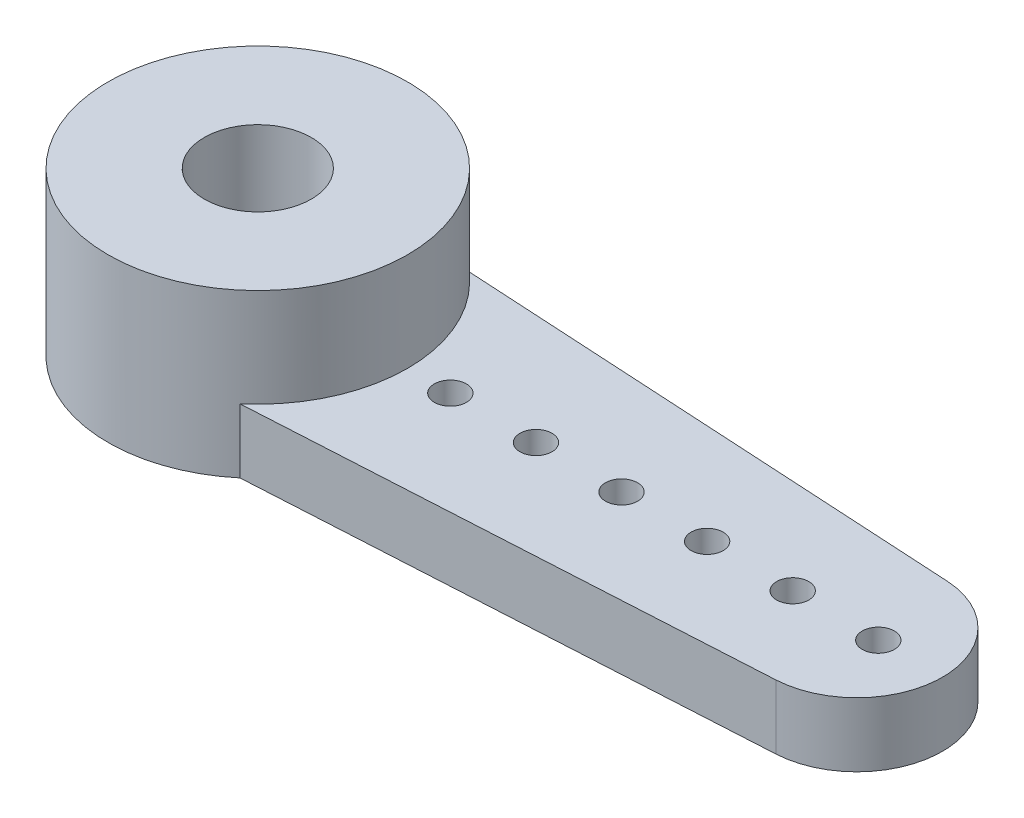
ISO-10303-21;
HEADER;
FILE_DESCRIPTION(('STEP AP214'),'2;1');
FILE_NAME('part.step','',(''),(''),'','','');
FILE_SCHEMA(('AUTOMOTIVE_DESIGN { 1 0 10303 214 1 1 1 1 }'));
ENDSEC;
DATA;
#1=APPLICATION_CONTEXT('core data for automotive mechanical design processes');
#2=APPLICATION_PROTOCOL_DEFINITION('international standard','automotive_design',2000,#1);
#3=PRODUCT_CONTEXT('',#1,'mechanical');
#4=PRODUCT('Part','Part','',(#3));
#5=PRODUCT_RELATED_PRODUCT_CATEGORY('part','',(#4));
#6=PRODUCT_DEFINITION_FORMATION('','',#4);
#7=PRODUCT_DEFINITION_CONTEXT('part definition',#1,'design');
#8=PRODUCT_DEFINITION('design','',#6,#7);
#9=PRODUCT_DEFINITION_SHAPE('','',#8);
#10=(LENGTH_UNIT() NAMED_UNIT(*) SI_UNIT(.MILLI.,.METRE.));
#11=(NAMED_UNIT(*) PLANE_ANGLE_UNIT() SI_UNIT($,.RADIAN.));
#12=(NAMED_UNIT(*) SI_UNIT($,.STERADIAN.) SOLID_ANGLE_UNIT());
#13=UNCERTAINTY_MEASURE_WITH_UNIT(LENGTH_MEASURE(1.E-05),#10,'distance_accuracy_value','');
#14=(GEOMETRIC_REPRESENTATION_CONTEXT(3) GLOBAL_UNCERTAINTY_ASSIGNED_CONTEXT((#13)) GLOBAL_UNIT_ASSIGNED_CONTEXT((#10,
#11,#12)) REPRESENTATION_CONTEXT('',''));
#15=CARTESIAN_POINT('',(0.,0.,0.));
#16=DIRECTION('',(0.,0.,1.));
#17=DIRECTION('',(1.,0.,0.));
#18=AXIS2_PLACEMENT_3D('',#15,#16,#17);
#19=CARTESIAN_POINT('',(0.,1.5,0.));
#20=DIRECTION('',(0.,-1.,0.));
#21=DIRECTION('',(0.,0.,-1.));
#22=AXIS2_PLACEMENT_3D('',#19,#20,#21);
#23=CYLINDRICAL_SURFACE('',#22,3.5);
#24=CARTESIAN_POINT('',(0.,0.,0.));
#25=DIRECTION('',(0.,1.,0.));
#26=DIRECTION('',(0.,0.,1.));
#27=AXIS2_PLACEMENT_3D('',#24,#25,#26);
#28=CIRCLE('',#27,3.5);
#29=CARTESIAN_POINT('',(2.25707221860533,0.,-2.675));
#30=VERTEX_POINT('',#29);
#31=CARTESIAN_POINT('',(2.25707221860533,0.,2.675));
#32=VERTEX_POINT('',#31);
#33=EDGE_CURVE('E88',#30,#32,#28,.T.);
#34=ORIENTED_EDGE('',*,*,#33,.T.);
#35=DIRECTION('',(0.,-1.,0.));
#36=VECTOR('',#35,1.);
#37=CARTESIAN_POINT('',(2.25707221860533,1.5,2.675));
#38=LINE('',#37,#36);
#39=CARTESIAN_POINT('',(2.25707221860533,1.5,2.675));
#40=VERTEX_POINT('',#39);
#41=EDGE_CURVE('E12',#40,#32,#38,.T.);
#42=ORIENTED_EDGE('',*,*,#41,.F.);
#43=CARTESIAN_POINT('',(0.,1.5,0.));
#44=DIRECTION('',(0.,1.,0.));
#45=DIRECTION('',(0.,0.,1.));
#46=AXIS2_PLACEMENT_3D('',#43,#44,#45);
#47=CIRCLE('',#46,3.5);
#48=CARTESIAN_POINT('',(2.25707221860533,1.5,-2.675));
#49=VERTEX_POINT('',#48);
#50=EDGE_CURVE('E86',#40,#49,#47,.T.);
#51=ORIENTED_EDGE('',*,*,#50,.T.);
#52=DIRECTION('',(0.,-1.,0.));
#53=VECTOR('',#52,1.);
#54=CARTESIAN_POINT('',(2.25707221860533,1.5,-2.675));
#55=LINE('',#54,#53);
#56=EDGE_CURVE('E107',#49,#30,#55,.T.);
#57=ORIENTED_EDGE('',*,*,#56,.T.);
#58=EDGE_LOOP('',(#34,#42,#51,#57));
#59=FACE_BOUND('',#58,.T.);
#60=CARTESIAN_POINT('',(0.,3.8,0.));
#61=DIRECTION('',(0.,1.,0.));
#62=DIRECTION('',(0.,0.,1.));
#63=AXIS2_PLACEMENT_3D('',#60,#61,#62);
#64=CIRCLE('',#63,3.5);
#65=CARTESIAN_POINT('',(0.,3.8,3.5));
#66=VERTEX_POINT('',#65);
#67=EDGE_CURVE('E95',#66,#66,#64,.T.);
#68=ORIENTED_EDGE('',*,*,#67,.F.);
#69=EDGE_LOOP('',(#68));
#70=FACE_BOUND('',#69,.T.);
#71=ADVANCED_FACE('F35',(#59,#70),#23,.T.);
#72=CARTESIAN_POINT('',(14.1106495792047,1.5,2.));
#73=DIRECTION('',(-0.0568527304419953,0.,-0.998382575489622));
#74=DIRECTION('',(-0.998382575489622,0.,0.0568527304419953));
#75=AXIS2_PLACEMENT_3D('',#72,#73,#74);
#76=PLANE('',#75);
#77=DIRECTION('',(0.998382575489622,0.,-0.0568527304419953));
#78=VECTOR('',#77,1.);
#79=CARTESIAN_POINT('',(14.1106495792047,0.,2.));
#80=LINE('',#79,#78);
#81=CARTESIAN_POINT('',(14.1106495792047,0.,2.));
#82=VERTEX_POINT('',#81);
#83=EDGE_CURVE('E109',#32,#82,#80,.T.);
#84=ORIENTED_EDGE('',*,*,#83,.T.);
#85=DIRECTION('',(0.,-1.,0.));
#86=VECTOR('',#85,1.);
#87=CARTESIAN_POINT('',(14.1106495792047,1.5,2.));
#88=LINE('',#87,#86);
#89=CARTESIAN_POINT('',(14.1106495792047,1.5,2.));
#90=VERTEX_POINT('',#89);
#91=EDGE_CURVE('E43',#90,#82,#88,.T.);
#92=ORIENTED_EDGE('',*,*,#91,.F.);
#93=DIRECTION('',(0.998382575489622,0.,-0.0568527304419953));
#94=VECTOR('',#93,1.);
#95=CARTESIAN_POINT('',(14.1106495792047,1.5,2.));
#96=LINE('',#95,#94);
#97=EDGE_CURVE('E78',#40,#90,#96,.T.);
#98=ORIENTED_EDGE('',*,*,#97,.F.);
#99=ORIENTED_EDGE('',*,*,#41,.T.);
#100=EDGE_LOOP('',(#84,#92,#98,#99));
#101=FACE_BOUND('',#100,.T.);
#102=ADVANCED_FACE('F90',(#101),#76,.F.);
#103=CARTESIAN_POINT('',(13.9967599103789,1.5,0.));
#104=DIRECTION('',(0.,-1.,0.));
#105=DIRECTION('',(0.,0.,-1.));
#106=AXIS2_PLACEMENT_3D('',#103,#104,#105);
#107=CYLINDRICAL_SURFACE('',#106,2.00324008962113);
#108=CARTESIAN_POINT('',(13.9967599103789,0.,0.));
#109=DIRECTION('',(0.,1.,0.));
#110=DIRECTION('',(0.,0.,-1.));
#111=AXIS2_PLACEMENT_3D('',#108,#109,#110);
#112=CIRCLE('',#111,2.00324008962113);
#113=CARTESIAN_POINT('',(14.1106495792047,0.,-2.));
#114=VERTEX_POINT('',#113);
#115=EDGE_CURVE('E69',#82,#114,#112,.T.);
#116=ORIENTED_EDGE('',*,*,#115,.T.);
#117=DIRECTION('',(0.,-1.,0.));
#118=VECTOR('',#117,1.);
#119=CARTESIAN_POINT('',(14.1106495792047,1.5,-2.));
#120=LINE('',#119,#118);
#121=CARTESIAN_POINT('',(14.1106495792047,1.5,-2.));
#122=VERTEX_POINT('',#121);
#123=EDGE_CURVE('E114',#122,#114,#120,.T.);
#124=ORIENTED_EDGE('',*,*,#123,.F.);
#125=CARTESIAN_POINT('',(13.9967599103789,1.5,0.));
#126=DIRECTION('',(0.,1.,0.));
#127=DIRECTION('',(0.,0.,-1.));
#128=AXIS2_PLACEMENT_3D('',#125,#126,#127);
#129=CIRCLE('',#128,2.00324008962113);
#130=EDGE_CURVE('E92',#90,#122,#129,.T.);
#131=ORIENTED_EDGE('',*,*,#130,.F.);
#132=ORIENTED_EDGE('',*,*,#91,.T.);
#133=EDGE_LOOP('',(#116,#124,#131,#132));
#134=FACE_BOUND('',#133,.T.);
#135=ADVANCED_FACE('F115',(#134),#107,.T.);
#136=CARTESIAN_POINT('',(2.25707221860533,1.5,-2.675));
#137=DIRECTION('',(-0.0568527304419953,0.,0.998382575489622));
#138=DIRECTION('',(0.998382575489622,0.,0.0568527304419953));
#139=AXIS2_PLACEMENT_3D('',#136,#137,#138);
#140=PLANE('',#139);
#141=DIRECTION('',(-0.998382575489622,0.,-0.0568527304419953));
#142=VECTOR('',#141,1.);
#143=CARTESIAN_POINT('',(2.25707221860533,0.,-2.675));
#144=LINE('',#143,#142);
#145=EDGE_CURVE('E74',#114,#30,#144,.T.);
#146=ORIENTED_EDGE('',*,*,#145,.T.);
#147=ORIENTED_EDGE('',*,*,#56,.F.);
#148=DIRECTION('',(-0.998382575489622,0.,-0.0568527304419953));
#149=VECTOR('',#148,1.);
#150=CARTESIAN_POINT('',(2.25707221860533,1.5,-2.675));
#151=LINE('',#150,#149);
#152=EDGE_CURVE('E51',#122,#49,#151,.T.);
#153=ORIENTED_EDGE('',*,*,#152,.F.);
#154=ORIENTED_EDGE('',*,*,#123,.T.);
#155=EDGE_LOOP('',(#146,#147,#153,#154));
#156=FACE_BOUND('',#155,.T.);
#157=ADVANCED_FACE('F129',(#156),#140,.F.);
#158=CARTESIAN_POINT('',(0.,1.5,0.));
#159=DIRECTION('',(0.,1.,0.));
#160=DIRECTION('',(0.,0.,1.));
#161=AXIS2_PLACEMENT_3D('',#158,#159,#160);
#162=PLANE('',#161);
#163=CARTESIAN_POINT('',(4.5,1.5,0.));
#164=DIRECTION('',(0.,1.,0.));
#165=DIRECTION('',(0.,0.,1.));
#166=AXIS2_PLACEMENT_3D('',#163,#164,#165);
#167=CIRCLE('',#166,0.375);
#168=CARTESIAN_POINT('',(4.5,1.5,0.375));
#169=VERTEX_POINT('',#168);
#170=EDGE_CURVE('E96',#169,#169,#167,.T.);
#171=ORIENTED_EDGE('',*,*,#170,.F.);
#172=EDGE_LOOP('',(#171));
#173=FACE_BOUND('',#172,.T.);
#174=CARTESIAN_POINT('',(8.5,1.5,0.));
#175=DIRECTION('',(0.,1.,0.));
#176=DIRECTION('',(0.,0.,1.));
#177=AXIS2_PLACEMENT_3D('',#174,#175,#176);
#178=CIRCLE('',#177,0.375000000000001);
#179=CARTESIAN_POINT('',(8.5,1.5,0.375000000000001));
#180=VERTEX_POINT('',#179);
#181=EDGE_CURVE('E101',#180,#180,#178,.T.);
#182=ORIENTED_EDGE('',*,*,#181,.F.);
#183=EDGE_LOOP('',(#182));
#184=FACE_BOUND('',#183,.T.);
#185=CARTESIAN_POINT('',(10.5,1.5,0.));
#186=DIRECTION('',(0.,1.,0.));
#187=DIRECTION('',(0.,0.,1.));
#188=AXIS2_PLACEMENT_3D('',#185,#186,#187);
#189=CIRCLE('',#188,0.375000000000001);
#190=CARTESIAN_POINT('',(10.5,1.5,0.375000000000001));
#191=VERTEX_POINT('',#190);
#192=EDGE_CURVE('E267',#191,#191,#189,.T.);
#193=ORIENTED_EDGE('',*,*,#192,.F.);
#194=EDGE_LOOP('',(#193));
#195=FACE_BOUND('',#194,.T.);
#196=CARTESIAN_POINT('',(12.5,1.5,0.));
#197=DIRECTION('',(0.,1.,0.));
#198=DIRECTION('',(0.,0.,1.));
#199=AXIS2_PLACEMENT_3D('',#196,#197,#198);
#200=CIRCLE('',#199,0.375000000000001);
#201=CARTESIAN_POINT('',(12.5,1.5,0.375000000000001));
#202=VERTEX_POINT('',#201);
#203=EDGE_CURVE('E264',#202,#202,#200,.T.);
#204=ORIENTED_EDGE('',*,*,#203,.F.);
#205=EDGE_LOOP('',(#204));
#206=FACE_BOUND('',#205,.T.);
#207=CARTESIAN_POINT('',(14.5,1.5,0.));
#208=DIRECTION('',(0.,1.,0.));
#209=DIRECTION('',(0.,0.,1.));
#210=AXIS2_PLACEMENT_3D('',#207,#208,#209);
#211=CIRCLE('',#210,0.374999999999999);
#212=CARTESIAN_POINT('',(14.5,1.5,0.374999999999999));
#213=VERTEX_POINT('',#212);
#214=EDGE_CURVE('E261',#213,#213,#211,.T.);
#215=ORIENTED_EDGE('',*,*,#214,.F.);
#216=EDGE_LOOP('',(#215));
#217=FACE_BOUND('',#216,.T.);
#218=CARTESIAN_POINT('',(6.5,1.5,0.));
#219=DIRECTION('',(0.,1.,0.));
#220=DIRECTION('',(0.,0.,1.));
#221=AXIS2_PLACEMENT_3D('',#218,#219,#220);
#222=CIRCLE('',#221,0.375000000000001);
#223=CARTESIAN_POINT('',(6.5,1.5,0.375000000000001));
#224=VERTEX_POINT('',#223);
#225=EDGE_CURVE('E244',#224,#224,#222,.T.);
#226=ORIENTED_EDGE('',*,*,#225,.F.);
#227=EDGE_LOOP('',(#226));
#228=FACE_BOUND('',#227,.T.);
#229=ORIENTED_EDGE('',*,*,#50,.F.);
#230=ORIENTED_EDGE('',*,*,#97,.T.);
#231=ORIENTED_EDGE('',*,*,#130,.T.);
#232=ORIENTED_EDGE('',*,*,#152,.T.);
#233=EDGE_LOOP('',(#229,#230,#231,#232));
#234=FACE_BOUND('',#233,.T.);
#235=ADVANCED_FACE('F94',(#173,#184,#195,#206,#217,#228,#234),#162,.T.);
#236=CARTESIAN_POINT('',(0.,0.,0.));
#237=DIRECTION('',(0.,1.,0.));
#238=DIRECTION('',(0.,0.,1.));
#239=AXIS2_PLACEMENT_3D('',#236,#237,#238);
#240=PLANE('',#239);
#241=CARTESIAN_POINT('',(4.5,0.,0.));
#242=DIRECTION('',(0.,1.,0.));
#243=DIRECTION('',(0.,0.,1.));
#244=AXIS2_PLACEMENT_3D('',#241,#242,#243);
#245=CIRCLE('',#244,0.375);
#246=CARTESIAN_POINT('',(4.5,0.,0.375));
#247=VERTEX_POINT('',#246);
#248=EDGE_CURVE('E239',#247,#247,#245,.T.);
#249=ORIENTED_EDGE('',*,*,#248,.T.);
#250=EDGE_LOOP('',(#249));
#251=FACE_BOUND('',#250,.T.);
#252=CARTESIAN_POINT('',(8.5,0.,0.));
#253=DIRECTION('',(0.,1.,0.));
#254=DIRECTION('',(0.,0.,1.));
#255=AXIS2_PLACEMENT_3D('',#252,#253,#254);
#256=CIRCLE('',#255,0.375000000000001);
#257=CARTESIAN_POINT('',(8.5,0.,0.375000000000001));
#258=VERTEX_POINT('',#257);
#259=EDGE_CURVE('E241',#258,#258,#256,.T.);
#260=ORIENTED_EDGE('',*,*,#259,.T.);
#261=EDGE_LOOP('',(#260));
#262=FACE_BOUND('',#261,.T.);
#263=CARTESIAN_POINT('',(10.5,0.,0.));
#264=DIRECTION('',(0.,1.,0.));
#265=DIRECTION('',(0.,0.,1.));
#266=AXIS2_PLACEMENT_3D('',#263,#264,#265);
#267=CIRCLE('',#266,0.375000000000001);
#268=CARTESIAN_POINT('',(10.5,0.,0.375000000000001));
#269=VERTEX_POINT('',#268);
#270=EDGE_CURVE('E247',#269,#269,#267,.T.);
#271=ORIENTED_EDGE('',*,*,#270,.T.);
#272=EDGE_LOOP('',(#271));
#273=FACE_BOUND('',#272,.T.);
#274=CARTESIAN_POINT('',(12.5,0.,0.));
#275=DIRECTION('',(0.,1.,0.));
#276=DIRECTION('',(0.,0.,1.));
#277=AXIS2_PLACEMENT_3D('',#274,#275,#276);
#278=CIRCLE('',#277,0.375000000000001);
#279=CARTESIAN_POINT('',(12.5,0.,0.375000000000001));
#280=VERTEX_POINT('',#279);
#281=EDGE_CURVE('E255',#280,#280,#278,.T.);
#282=ORIENTED_EDGE('',*,*,#281,.T.);
#283=EDGE_LOOP('',(#282));
#284=FACE_BOUND('',#283,.T.);
#285=CARTESIAN_POINT('',(14.5,0.,0.));
#286=DIRECTION('',(0.,1.,0.));
#287=DIRECTION('',(0.,0.,1.));
#288=AXIS2_PLACEMENT_3D('',#285,#286,#287);
#289=CIRCLE('',#288,0.374999999999999);
#290=CARTESIAN_POINT('',(14.5,0.,0.374999999999999));
#291=VERTEX_POINT('',#290);
#292=EDGE_CURVE('E257',#291,#291,#289,.T.);
#293=ORIENTED_EDGE('',*,*,#292,.T.);
#294=EDGE_LOOP('',(#293));
#295=FACE_BOUND('',#294,.T.);
#296=CARTESIAN_POINT('',(0.,0.,0.));
#297=DIRECTION('',(0.,1.,0.));
#298=DIRECTION('',(0.,0.,1.));
#299=AXIS2_PLACEMENT_3D('',#296,#297,#298);
#300=CIRCLE('',#299,1.25);
#301=CARTESIAN_POINT('',(0.,0.,1.25));
#302=VERTEX_POINT('',#301);
#303=EDGE_CURVE('E250',#302,#302,#300,.T.);
#304=ORIENTED_EDGE('',*,*,#303,.T.);
#305=EDGE_LOOP('',(#304));
#306=FACE_BOUND('',#305,.T.);
#307=CARTESIAN_POINT('',(6.5,0.,0.));
#308=DIRECTION('',(0.,1.,0.));
#309=DIRECTION('',(0.,0.,1.));
#310=AXIS2_PLACEMENT_3D('',#307,#308,#309);
#311=CIRCLE('',#310,0.375000000000001);
#312=CARTESIAN_POINT('',(6.5,0.,0.375000000000001));
#313=VERTEX_POINT('',#312);
#314=EDGE_CURVE('E240',#313,#313,#311,.T.);
#315=ORIENTED_EDGE('',*,*,#314,.T.);
#316=EDGE_LOOP('',(#315));
#317=FACE_BOUND('',#316,.T.);
#318=ORIENTED_EDGE('',*,*,#33,.F.);
#319=ORIENTED_EDGE('',*,*,#145,.F.);
#320=ORIENTED_EDGE('',*,*,#115,.F.);
#321=ORIENTED_EDGE('',*,*,#83,.F.);
#322=EDGE_LOOP('',(#318,#319,#320,#321));
#323=FACE_BOUND('',#322,.T.);
#324=ADVANCED_FACE('F117',(#251,#262,#273,#284,#295,#306,#317,#323),#240,.F.);
#325=CARTESIAN_POINT('',(0.,3.8,0.));
#326=DIRECTION('',(0.,1.,0.));
#327=DIRECTION('',(0.,0.,1.));
#328=AXIS2_PLACEMENT_3D('',#325,#326,#327);
#329=PLANE('',#328);
#330=CARTESIAN_POINT('',(0.,3.8,0.));
#331=DIRECTION('',(0.,1.,0.));
#332=DIRECTION('',(0.,0.,1.));
#333=AXIS2_PLACEMENT_3D('',#330,#331,#332);
#334=CIRCLE('',#333,1.25);
#335=CARTESIAN_POINT('',(0.,3.8,1.25));
#336=VERTEX_POINT('',#335);
#337=EDGE_CURVE('E290',#336,#336,#334,.T.);
#338=ORIENTED_EDGE('',*,*,#337,.F.);
#339=EDGE_LOOP('',(#338));
#340=FACE_BOUND('',#339,.T.);
#341=ORIENTED_EDGE('',*,*,#67,.T.);
#342=EDGE_LOOP('',(#341));
#343=FACE_BOUND('',#342,.T.);
#344=ADVANCED_FACE('F119',(#340,#343),#329,.T.);
#345=CARTESIAN_POINT('',(0.,0.,0.));
#346=DIRECTION('',(0.,1.,0.));
#347=DIRECTION('',(0.,0.,1.));
#348=AXIS2_PLACEMENT_3D('',#345,#346,#347);
#349=CYLINDRICAL_SURFACE('',#348,1.25);
#350=ORIENTED_EDGE('',*,*,#303,.F.);
#351=EDGE_LOOP('',(#350));
#352=FACE_BOUND('',#351,.T.);
#353=ORIENTED_EDGE('',*,*,#337,.T.);
#354=EDGE_LOOP('',(#353));
#355=FACE_BOUND('',#354,.T.);
#356=ADVANCED_FACE('F126',(#352,#355),#349,.F.);
#357=CARTESIAN_POINT('',(6.5,0.,0.));
#358=DIRECTION('',(0.,1.,0.));
#359=DIRECTION('',(0.,0.,1.));
#360=AXIS2_PLACEMENT_3D('',#357,#358,#359);
#361=CYLINDRICAL_SURFACE('',#360,0.375000000000001);
#362=ORIENTED_EDGE('',*,*,#225,.T.);
#363=EDGE_LOOP('',(#362));
#364=FACE_BOUND('',#363,.T.);
#365=ORIENTED_EDGE('',*,*,#314,.F.);
#366=EDGE_LOOP('',(#365));
#367=FACE_BOUND('',#366,.T.);
#368=ADVANCED_FACE('F172',(#364,#367),#361,.F.);
#369=CARTESIAN_POINT('',(14.5,0.,0.));
#370=DIRECTION('',(0.,1.,0.));
#371=DIRECTION('',(0.,0.,1.));
#372=AXIS2_PLACEMENT_3D('',#369,#370,#371);
#373=CYLINDRICAL_SURFACE('',#372,0.374999999999999);
#374=ORIENTED_EDGE('',*,*,#214,.T.);
#375=EDGE_LOOP('',(#374));
#376=FACE_BOUND('',#375,.T.);
#377=ORIENTED_EDGE('',*,*,#292,.F.);
#378=EDGE_LOOP('',(#377));
#379=FACE_BOUND('',#378,.T.);
#380=ADVANCED_FACE('F182',(#376,#379),#373,.F.);
#381=CARTESIAN_POINT('',(12.5,0.,0.));
#382=DIRECTION('',(0.,1.,0.));
#383=DIRECTION('',(0.,0.,1.));
#384=AXIS2_PLACEMENT_3D('',#381,#382,#383);
#385=CYLINDRICAL_SURFACE('',#384,0.375000000000001);
#386=ORIENTED_EDGE('',*,*,#203,.T.);
#387=EDGE_LOOP('',(#386));
#388=FACE_BOUND('',#387,.T.);
#389=ORIENTED_EDGE('',*,*,#281,.F.);
#390=EDGE_LOOP('',(#389));
#391=FACE_BOUND('',#390,.T.);
#392=ADVANCED_FACE('F192',(#388,#391),#385,.F.);
#393=CARTESIAN_POINT('',(10.5,0.,0.));
#394=DIRECTION('',(0.,1.,0.));
#395=DIRECTION('',(0.,0.,1.));
#396=AXIS2_PLACEMENT_3D('',#393,#394,#395);
#397=CYLINDRICAL_SURFACE('',#396,0.375000000000001);
#398=ORIENTED_EDGE('',*,*,#192,.T.);
#399=EDGE_LOOP('',(#398));
#400=FACE_BOUND('',#399,.T.);
#401=ORIENTED_EDGE('',*,*,#270,.F.);
#402=EDGE_LOOP('',(#401));
#403=FACE_BOUND('',#402,.T.);
#404=ADVANCED_FACE('F202',(#400,#403),#397,.F.);
#405=CARTESIAN_POINT('',(8.5,0.,0.));
#406=DIRECTION('',(0.,1.,0.));
#407=DIRECTION('',(0.,0.,1.));
#408=AXIS2_PLACEMENT_3D('',#405,#406,#407);
#409=CYLINDRICAL_SURFACE('',#408,0.375000000000001);
#410=ORIENTED_EDGE('',*,*,#181,.T.);
#411=EDGE_LOOP('',(#410));
#412=FACE_BOUND('',#411,.T.);
#413=ORIENTED_EDGE('',*,*,#259,.F.);
#414=EDGE_LOOP('',(#413));
#415=FACE_BOUND('',#414,.T.);
#416=ADVANCED_FACE('F212',(#412,#415),#409,.F.);
#417=CARTESIAN_POINT('',(4.5,0.,0.));
#418=DIRECTION('',(0.,1.,0.));
#419=DIRECTION('',(0.,0.,1.));
#420=AXIS2_PLACEMENT_3D('',#417,#418,#419);
#421=CYLINDRICAL_SURFACE('',#420,0.375);
#422=ORIENTED_EDGE('',*,*,#170,.T.);
#423=EDGE_LOOP('',(#422));
#424=FACE_BOUND('',#423,.T.);
#425=ORIENTED_EDGE('',*,*,#248,.F.);
#426=EDGE_LOOP('',(#425));
#427=FACE_BOUND('',#426,.T.);
#428=ADVANCED_FACE('F222',(#424,#427),#421,.F.);
#429=CLOSED_SHELL('',(#71,#102,#135,#157,#235,#324,#344,#356,#368,#380,#392,#404,#416,#428));
#430=MANIFOLD_SOLID_BREP('B2',#429);
#431=ADVANCED_BREP_SHAPE_REPRESENTATION('',(#18,#430),#14);
#432=SHAPE_DEFINITION_REPRESENTATION(#9,#431);
ENDSEC;
END-ISO-10303-21;
